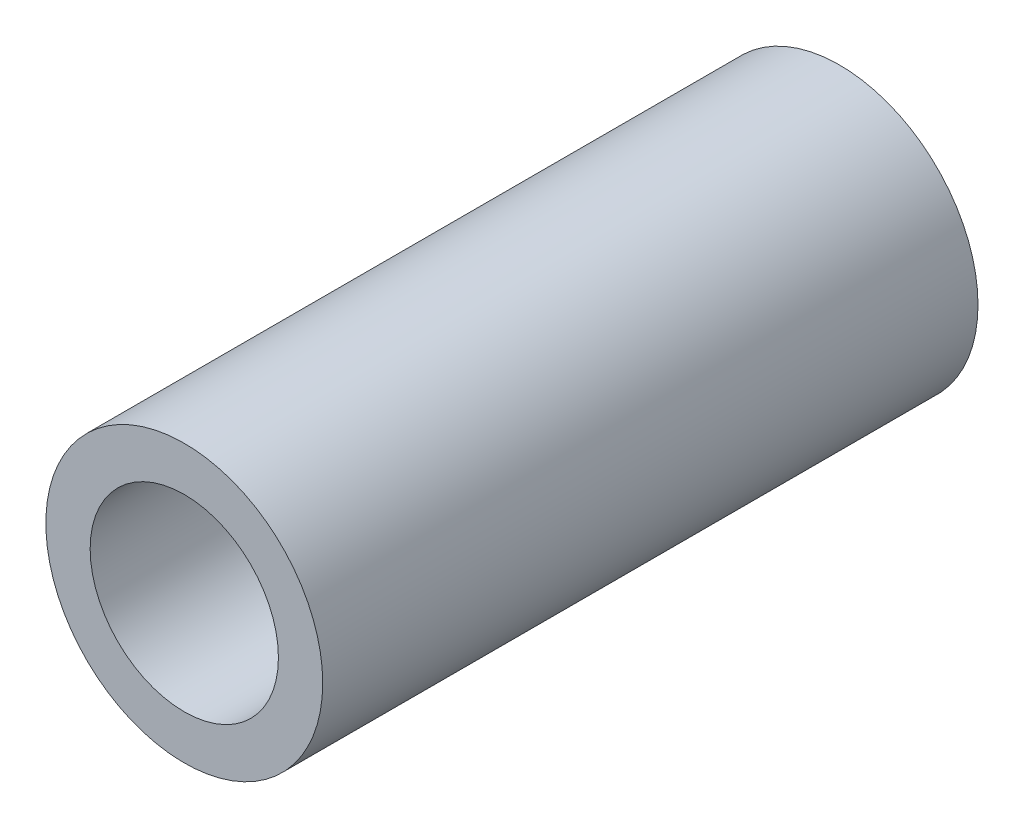
ISO-10303-21;
HEADER;
FILE_DESCRIPTION(('STEP AP214'),'2;1');
FILE_NAME('part.step','',(''),(''),'','','');
FILE_SCHEMA(('AUTOMOTIVE_DESIGN { 1 0 10303 214 1 1 1 1 }'));
ENDSEC;
DATA;
#1=APPLICATION_CONTEXT('core data for automotive mechanical design processes');
#2=APPLICATION_PROTOCOL_DEFINITION('international standard','automotive_design',2000,#1);
#3=PRODUCT_CONTEXT('',#1,'mechanical');
#4=PRODUCT('Part','Part','',(#3));
#5=PRODUCT_RELATED_PRODUCT_CATEGORY('part','',(#4));
#6=PRODUCT_DEFINITION_FORMATION('','',#4);
#7=PRODUCT_DEFINITION_CONTEXT('part definition',#1,'design');
#8=PRODUCT_DEFINITION('design','',#6,#7);
#9=PRODUCT_DEFINITION_SHAPE('','',#8);
#10=(LENGTH_UNIT() NAMED_UNIT(*) SI_UNIT(.MILLI.,.METRE.));
#11=(NAMED_UNIT(*) PLANE_ANGLE_UNIT() SI_UNIT($,.RADIAN.));
#12=(NAMED_UNIT(*) SI_UNIT($,.STERADIAN.) SOLID_ANGLE_UNIT());
#13=UNCERTAINTY_MEASURE_WITH_UNIT(LENGTH_MEASURE(1.E-05),#10,'distance_accuracy_value','');
#14=(GEOMETRIC_REPRESENTATION_CONTEXT(3) GLOBAL_UNCERTAINTY_ASSIGNED_CONTEXT((#13)) GLOBAL_UNIT_ASSIGNED_CONTEXT((#10,
#11,#12)) REPRESENTATION_CONTEXT('',''));
#15=CARTESIAN_POINT('',(0.,0.,0.));
#16=DIRECTION('',(0.,0.,1.));
#17=DIRECTION('',(1.,0.,0.));
#18=AXIS2_PLACEMENT_3D('',#15,#16,#17);
#19=CARTESIAN_POINT('',(0.,0.,35.5));
#20=DIRECTION('',(0.,0.,1.));
#21=DIRECTION('',(1.,0.,0.));
#22=AXIS2_PLACEMENT_3D('',#19,#20,#21);
#23=PLANE('',#22);
#24=CARTESIAN_POINT('',(0.,0.,35.5));
#25=DIRECTION('',(0.,0.,1.));
#26=DIRECTION('',(1.,0.,0.));
#27=AXIS2_PLACEMENT_3D('',#24,#25,#26);
#28=CIRCLE('',#27,7.5);
#29=CARTESIAN_POINT('',(7.5,0.,35.5));
#30=VERTEX_POINT('',#29);
#31=EDGE_CURVE('E10',#30,#30,#28,.T.);
#32=ORIENTED_EDGE('',*,*,#31,.T.);
#33=EDGE_LOOP('',(#32));
#34=FACE_BOUND('',#33,.T.);
#35=CARTESIAN_POINT('',(0.,0.,35.5));
#36=DIRECTION('',(0.,0.,1.));
#37=DIRECTION('',(1.,0.,0.));
#38=AXIS2_PLACEMENT_3D('',#35,#36,#37);
#39=CIRCLE('',#38,5.1);
#40=CARTESIAN_POINT('',(5.1,0.,35.5));
#41=VERTEX_POINT('',#40);
#42=EDGE_CURVE('E42',#41,#41,#39,.T.);
#43=ORIENTED_EDGE('',*,*,#42,.F.);
#44=EDGE_LOOP('',(#43));
#45=FACE_BOUND('',#44,.T.);
#46=ADVANCED_FACE('F31',(#34,#45),#23,.T.);
#47=CARTESIAN_POINT('',(0.,0.,0.));
#48=DIRECTION('',(0.,0.,1.));
#49=DIRECTION('',(1.,0.,0.));
#50=AXIS2_PLACEMENT_3D('',#47,#48,#49);
#51=PLANE('',#50);
#52=CARTESIAN_POINT('',(0.,0.,0.));
#53=DIRECTION('',(0.,0.,1.));
#54=DIRECTION('',(1.,0.,0.));
#55=AXIS2_PLACEMENT_3D('',#52,#53,#54);
#56=CIRCLE('',#55,7.5);
#57=CARTESIAN_POINT('',(7.5,0.,0.));
#58=VERTEX_POINT('',#57);
#59=EDGE_CURVE('E35',#58,#58,#56,.T.);
#60=ORIENTED_EDGE('',*,*,#59,.F.);
#61=EDGE_LOOP('',(#60));
#62=FACE_BOUND('',#61,.T.);
#63=CARTESIAN_POINT('',(0.,0.,0.));
#64=DIRECTION('',(0.,0.,1.));
#65=DIRECTION('',(1.,0.,0.));
#66=AXIS2_PLACEMENT_3D('',#63,#64,#65);
#67=CIRCLE('',#66,5.1);
#68=CARTESIAN_POINT('',(5.1,0.,0.));
#69=VERTEX_POINT('',#68);
#70=EDGE_CURVE('E44',#69,#69,#67,.T.);
#71=ORIENTED_EDGE('',*,*,#70,.T.);
#72=EDGE_LOOP('',(#71));
#73=FACE_BOUND('',#72,.T.);
#74=ADVANCED_FACE('F54',(#62,#73),#51,.F.);
#75=CARTESIAN_POINT('',(0.,0.,35.5));
#76=DIRECTION('',(0.,0.,-1.));
#77=DIRECTION('',(-1.,0.,0.));
#78=AXIS2_PLACEMENT_3D('',#75,#76,#77);
#79=CYLINDRICAL_SURFACE('',#78,7.5);
#80=ORIENTED_EDGE('',*,*,#31,.F.);
#81=EDGE_LOOP('',(#80));
#82=FACE_BOUND('',#81,.T.);
#83=ORIENTED_EDGE('',*,*,#59,.T.);
#84=EDGE_LOOP('',(#83));
#85=FACE_BOUND('',#84,.T.);
#86=ADVANCED_FACE('F33',(#82,#85),#79,.T.);
#87=CARTESIAN_POINT('',(0.,0.,35.5));
#88=DIRECTION('',(0.,0.,-1.));
#89=DIRECTION('',(-1.,0.,0.));
#90=AXIS2_PLACEMENT_3D('',#87,#88,#89);
#91=CYLINDRICAL_SURFACE('',#90,5.1);
#92=ORIENTED_EDGE('',*,*,#42,.T.);
#93=EDGE_LOOP('',(#92));
#94=FACE_BOUND('',#93,.T.);
#95=ORIENTED_EDGE('',*,*,#70,.F.);
#96=EDGE_LOOP('',(#95));
#97=FACE_BOUND('',#96,.T.);
#98=ADVANCED_FACE('F50',(#94,#97),#91,.F.);
#99=CLOSED_SHELL('',(#46,#74,#86,#98));
#100=MANIFOLD_SOLID_BREP('B2',#99);
#101=ADVANCED_BREP_SHAPE_REPRESENTATION('',(#18,#100),#14);
#102=SHAPE_DEFINITION_REPRESENTATION(#9,#101);
ENDSEC;
END-ISO-10303-21;
